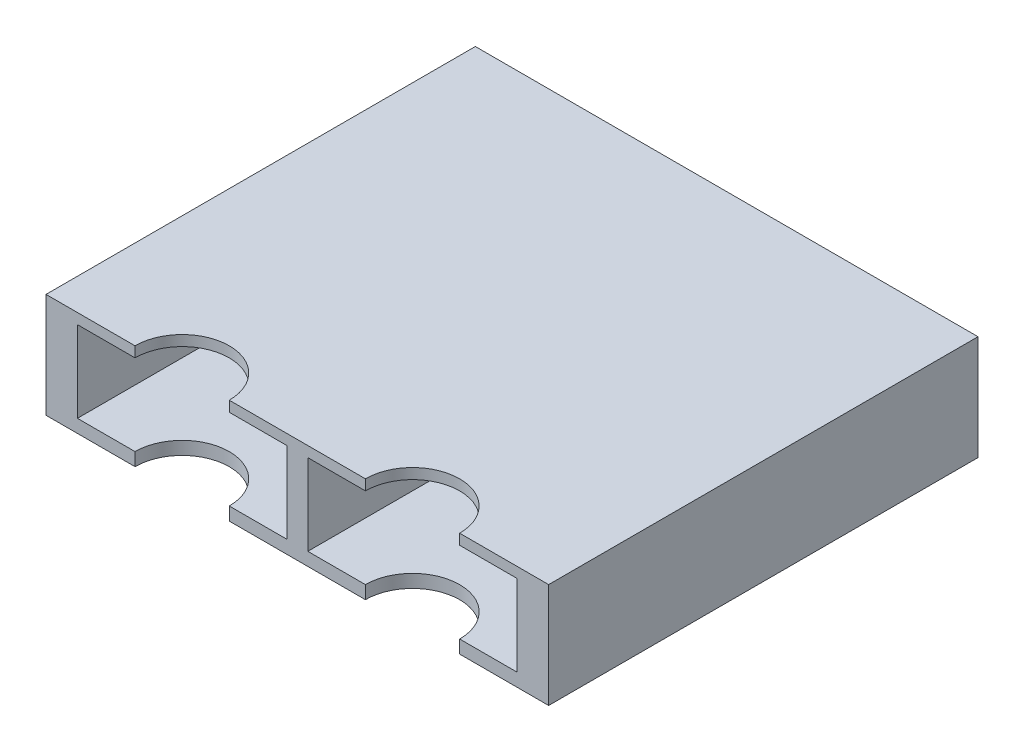
ISO-10303-21;
HEADER;
FILE_DESCRIPTION(('STEP AP214'),'2;1');
FILE_NAME('part.step','',(''),(''),'','','');
FILE_SCHEMA(('AUTOMOTIVE_DESIGN { 1 0 10303 214 1 1 1 1 }'));
ENDSEC;
DATA;
#1=APPLICATION_CONTEXT('core data for automotive mechanical design processes');
#2=APPLICATION_PROTOCOL_DEFINITION('international standard','automotive_design',2000,#1);
#3=PRODUCT_CONTEXT('',#1,'mechanical');
#4=PRODUCT('Part','Part','',(#3));
#5=PRODUCT_RELATED_PRODUCT_CATEGORY('part','',(#4));
#6=PRODUCT_DEFINITION_FORMATION('','',#4);
#7=PRODUCT_DEFINITION_CONTEXT('part definition',#1,'design');
#8=PRODUCT_DEFINITION('design','',#6,#7);
#9=PRODUCT_DEFINITION_SHAPE('','',#8);
#10=(LENGTH_UNIT() NAMED_UNIT(*) SI_UNIT(.MILLI.,.METRE.));
#11=(NAMED_UNIT(*) PLANE_ANGLE_UNIT() SI_UNIT($,.RADIAN.));
#12=(NAMED_UNIT(*) SI_UNIT($,.STERADIAN.) SOLID_ANGLE_UNIT());
#13=UNCERTAINTY_MEASURE_WITH_UNIT(LENGTH_MEASURE(1.E-05),#10,'distance_accuracy_value','');
#14=(GEOMETRIC_REPRESENTATION_CONTEXT(3) GLOBAL_UNCERTAINTY_ASSIGNED_CONTEXT((#13)) GLOBAL_UNIT_ASSIGNED_CONTEXT((#10,
#11,#12)) REPRESENTATION_CONTEXT('',''));
#15=CARTESIAN_POINT('',(0.,0.,0.));
#16=DIRECTION('',(0.,0.,1.));
#17=DIRECTION('',(1.,0.,0.));
#18=AXIS2_PLACEMENT_3D('',#15,#16,#17);
#19=CARTESIAN_POINT('',(26.,0.,82.));
#20=DIRECTION('',(0.,1.,0.));
#21=DIRECTION('',(0.,0.,1.));
#22=AXIS2_PLACEMENT_3D('',#19,#20,#21);
#23=CYLINDRICAL_SURFACE('',#22,9.);
#24=DIRECTION('',(0.,1.,0.));
#25=VECTOR('',#24,1.);
#26=CARTESIAN_POINT('',(35.,0.,82.));
#27=LINE('',#26,#25);
#28=CARTESIAN_POINT('',(35.,0.,82.));
#29=VERTEX_POINT('',#28);
#30=CARTESIAN_POINT('',(35.,2.5,82.));
#31=VERTEX_POINT('',#30);
#32=EDGE_CURVE('E259',#29,#31,#27,.T.);
#33=ORIENTED_EDGE('',*,*,#32,.T.);
#34=CARTESIAN_POINT('',(26.,2.5,82.));
#35=DIRECTION('',(0.,-1.,0.));
#36=DIRECTION('',(1.,0.,0.));
#37=AXIS2_PLACEMENT_3D('',#34,#35,#36);
#38=CIRCLE('',#37,9.);
#39=CARTESIAN_POINT('',(17.,2.5,82.));
#40=VERTEX_POINT('',#39);
#41=EDGE_CURVE('E11',#31,#40,#38,.F.);
#42=ORIENTED_EDGE('',*,*,#41,.T.);
#43=DIRECTION('',(0.,1.,0.));
#44=VECTOR('',#43,1.);
#45=CARTESIAN_POINT('',(17.,0.,82.));
#46=LINE('',#45,#44);
#47=CARTESIAN_POINT('',(17.,0.,82.));
#48=VERTEX_POINT('',#47);
#49=EDGE_CURVE('E277',#48,#40,#46,.T.);
#50=ORIENTED_EDGE('',*,*,#49,.F.);
#51=CARTESIAN_POINT('',(26.,0.,82.));
#52=DIRECTION('',(0.,1.,0.));
#53=DIRECTION('',(0.,0.,1.));
#54=AXIS2_PLACEMENT_3D('',#51,#52,#53);
#55=CIRCLE('',#54,9.);
#56=EDGE_CURVE('E268',#29,#48,#55,.T.);
#57=ORIENTED_EDGE('',*,*,#56,.F.);
#58=EDGE_LOOP('',(#33,#42,#50,#57));
#59=FACE_BOUND('',#58,.T.);
#60=ADVANCED_FACE('F37',(#59),#23,.F.);
#61=CARTESIAN_POINT('',(70.,0.,82.));
#62=DIRECTION('',(0.,1.,0.));
#63=DIRECTION('',(0.,0.,1.));
#64=AXIS2_PLACEMENT_3D('',#61,#62,#63);
#65=CYLINDRICAL_SURFACE('',#64,8.99999999999999);
#66=DIRECTION('',(0.,1.,0.));
#67=VECTOR('',#66,1.);
#68=CARTESIAN_POINT('',(61.,0.,82.));
#69=LINE('',#68,#67);
#70=CARTESIAN_POINT('',(61.,18.,82.));
#71=VERTEX_POINT('',#70);
#72=CARTESIAN_POINT('',(61.,20.,82.));
#73=VERTEX_POINT('',#72);
#74=EDGE_CURVE('E255',#71,#73,#69,.T.);
#75=ORIENTED_EDGE('',*,*,#74,.F.);
#76=CARTESIAN_POINT('',(70.,18.,82.));
#77=DIRECTION('',(0.,1.,0.));
#78=DIRECTION('',(-1.,0.,0.));
#79=AXIS2_PLACEMENT_3D('',#76,#77,#78);
#80=CIRCLE('',#79,8.99999999999999);
#81=CARTESIAN_POINT('',(79.,18.,82.));
#82=VERTEX_POINT('',#81);
#83=EDGE_CURVE('E317',#71,#82,#80,.F.);
#84=ORIENTED_EDGE('',*,*,#83,.T.);
#85=DIRECTION('',(0.,1.,0.));
#86=VECTOR('',#85,1.);
#87=CARTESIAN_POINT('',(79.,0.,82.));
#88=LINE('',#87,#86);
#89=CARTESIAN_POINT('',(79.,20.,82.));
#90=VERTEX_POINT('',#89);
#91=EDGE_CURVE('E264',#82,#90,#88,.T.);
#92=ORIENTED_EDGE('',*,*,#91,.T.);
#93=CARTESIAN_POINT('',(70.,20.,82.));
#94=DIRECTION('',(0.,1.,0.));
#95=DIRECTION('',(0.,0.,-1.));
#96=AXIS2_PLACEMENT_3D('',#93,#94,#95);
#97=CIRCLE('',#96,8.99999999999999);
#98=EDGE_CURVE('E256',#90,#73,#97,.T.);
#99=ORIENTED_EDGE('',*,*,#98,.T.);
#100=EDGE_LOOP('',(#75,#84,#92,#99));
#101=FACE_BOUND('',#100,.T.);
#102=ADVANCED_FACE('F370',(#101),#65,.F.);
#103=CARTESIAN_POINT('',(0.,0.,82.));
#104=DIRECTION('',(0.,0.,-1.));
#105=DIRECTION('',(-1.,0.,0.));
#106=AXIS2_PLACEMENT_3D('',#103,#104,#105);
#107=PLANE('',#106);
#108=DIRECTION('',(0.,1.,0.));
#109=VECTOR('',#108,1.);
#110=CARTESIAN_POINT('',(46.,18.,82.));
#111=LINE('',#110,#109);
#112=CARTESIAN_POINT('',(46.,2.50000000000001,82.));
#113=VERTEX_POINT('',#112);
#114=CARTESIAN_POINT('',(46.,18.,82.));
#115=VERTEX_POINT('',#114);
#116=EDGE_CURVE('E182',#113,#115,#111,.T.);
#117=ORIENTED_EDGE('',*,*,#116,.F.);
#118=DIRECTION('',(1.,0.,0.));
#119=VECTOR('',#118,1.);
#120=CARTESIAN_POINT('',(46.,2.50000000000001,82.));
#121=LINE('',#120,#119);
#122=EDGE_CURVE('E199',#31,#113,#121,.T.);
#123=ORIENTED_EDGE('',*,*,#122,.F.);
#124=ORIENTED_EDGE('',*,*,#32,.F.);
#125=DIRECTION('',(1.,0.,0.));
#126=VECTOR('',#125,1.);
#127=CARTESIAN_POINT('',(0.,0.,82.));
#128=LINE('',#127,#126);
#129=CARTESIAN_POINT('',(61.,0.,82.));
#130=VERTEX_POINT('',#129);
#131=EDGE_CURVE('E289',#29,#130,#128,.T.);
#132=ORIENTED_EDGE('',*,*,#131,.T.);
#133=CARTESIAN_POINT('',(61.,2.50000000000001,82.));
#134=VERTEX_POINT('',#133);
#135=EDGE_CURVE('E265',#130,#134,#69,.T.);
#136=ORIENTED_EDGE('',*,*,#135,.T.);
#137=DIRECTION('',(1.,0.,0.));
#138=VECTOR('',#137,1.);
#139=CARTESIAN_POINT('',(50.,2.50000000000001,82.));
#140=LINE('',#139,#138);
#141=CARTESIAN_POINT('',(50.,2.50000000000001,82.));
#142=VERTEX_POINT('',#141);
#143=EDGE_CURVE('E60',#142,#134,#140,.T.);
#144=ORIENTED_EDGE('',*,*,#143,.F.);
#145=DIRECTION('',(0.,-1.,0.));
#146=VECTOR('',#145,1.);
#147=CARTESIAN_POINT('',(50.,18.,82.));
#148=LINE('',#147,#146);
#149=CARTESIAN_POINT('',(50.,18.,82.));
#150=VERTEX_POINT('',#149);
#151=EDGE_CURVE('E236',#150,#142,#148,.T.);
#152=ORIENTED_EDGE('',*,*,#151,.F.);
#153=DIRECTION('',(-1.,0.,0.));
#154=VECTOR('',#153,1.);
#155=CARTESIAN_POINT('',(50.,18.,82.));
#156=LINE('',#155,#154);
#157=EDGE_CURVE('E237',#71,#150,#156,.T.);
#158=ORIENTED_EDGE('',*,*,#157,.F.);
#159=ORIENTED_EDGE('',*,*,#74,.T.);
#160=DIRECTION('',(-1.,0.,0.));
#161=VECTOR('',#160,1.);
#162=CARTESIAN_POINT('',(0.,20.,82.));
#163=LINE('',#162,#161);
#164=CARTESIAN_POINT('',(35.,20.,82.));
#165=VERTEX_POINT('',#164);
#166=EDGE_CURVE('E296',#73,#165,#163,.T.);
#167=ORIENTED_EDGE('',*,*,#166,.T.);
#168=CARTESIAN_POINT('',(35.,18.,82.));
#169=VERTEX_POINT('',#168);
#170=EDGE_CURVE('E276',#169,#165,#27,.T.);
#171=ORIENTED_EDGE('',*,*,#170,.F.);
#172=DIRECTION('',(-1.,0.,0.));
#173=VECTOR('',#172,1.);
#174=CARTESIAN_POINT('',(46.,18.,82.));
#175=LINE('',#174,#173);
#176=EDGE_CURVE('E52',#115,#169,#175,.T.);
#177=ORIENTED_EDGE('',*,*,#176,.F.);
#178=EDGE_LOOP('',(#117,#123,#124,#132,#136,#144,#152,#158,#159,#167,#171,#177));
#179=FACE_BOUND('',#178,.T.);
#180=ADVANCED_FACE('F327',(#179),#107,.F.);
#181=ORIENTED_EDGE('',*,*,#49,.T.);
#182=CARTESIAN_POINT('',(6.00000000000001,2.5,82.));
#183=VERTEX_POINT('',#182);
#184=EDGE_CURVE('E197',#183,#40,#121,.T.);
#185=ORIENTED_EDGE('',*,*,#184,.F.);
#186=DIRECTION('',(0.,-1.,0.));
#187=VECTOR('',#186,1.);
#188=CARTESIAN_POINT('',(6.00000000000001,18.,82.));
#189=LINE('',#188,#187);
#190=CARTESIAN_POINT('',(6.00000000000001,18.,82.));
#191=VERTEX_POINT('',#190);
#192=EDGE_CURVE('E211',#191,#183,#189,.T.);
#193=ORIENTED_EDGE('',*,*,#192,.F.);
#194=CARTESIAN_POINT('',(17.,18.,82.));
#195=VERTEX_POINT('',#194);
#196=EDGE_CURVE('E208',#195,#191,#175,.T.);
#197=ORIENTED_EDGE('',*,*,#196,.F.);
#198=CARTESIAN_POINT('',(17.,20.,82.));
#199=VERTEX_POINT('',#198);
#200=EDGE_CURVE('E271',#195,#199,#46,.T.);
#201=ORIENTED_EDGE('',*,*,#200,.T.);
#202=CARTESIAN_POINT('',(0.,20.,82.));
#203=VERTEX_POINT('',#202);
#204=EDGE_CURVE('E291',#199,#203,#163,.T.);
#205=ORIENTED_EDGE('',*,*,#204,.T.);
#206=DIRECTION('',(0.,-1.,0.));
#207=VECTOR('',#206,1.);
#208=CARTESIAN_POINT('',(0.,0.,82.));
#209=LINE('',#208,#207);
#210=CARTESIAN_POINT('',(0.,0.,82.));
#211=VERTEX_POINT('',#210);
#212=EDGE_CURVE('E280',#203,#211,#209,.T.);
#213=ORIENTED_EDGE('',*,*,#212,.T.);
#214=EDGE_CURVE('E285',#211,#48,#128,.T.);
#215=ORIENTED_EDGE('',*,*,#214,.T.);
#216=EDGE_LOOP('',(#181,#185,#193,#197,#201,#205,#213,#215));
#217=FACE_BOUND('',#216,.T.);
#218=ADVANCED_FACE('F336',(#217),#107,.F.);
#219=CARTESIAN_POINT('',(0.,0.,82.));
#220=DIRECTION('',(1.,0.,0.));
#221=DIRECTION('',(0.,0.,-1.));
#222=AXIS2_PLACEMENT_3D('',#219,#220,#221);
#223=PLANE('',#222);
#224=DIRECTION('',(0.,-1.,0.));
#225=VECTOR('',#224,1.);
#226=CARTESIAN_POINT('',(0.,0.,0.));
#227=LINE('',#226,#225);
#228=CARTESIAN_POINT('',(0.,20.,0.));
#229=VERTEX_POINT('',#228);
#230=CARTESIAN_POINT('',(0.,0.,0.));
#231=VERTEX_POINT('',#230);
#232=EDGE_CURVE('E263',#229,#231,#227,.T.);
#233=ORIENTED_EDGE('',*,*,#232,.T.);
#234=DIRECTION('',(0.,0.,-1.));
#235=VECTOR('',#234,1.);
#236=CARTESIAN_POINT('',(0.,0.,82.));
#237=LINE('',#236,#235);
#238=EDGE_CURVE('E312',#211,#231,#237,.T.);
#239=ORIENTED_EDGE('',*,*,#238,.F.);
#240=ORIENTED_EDGE('',*,*,#212,.F.);
#241=DIRECTION('',(0.,0.,-1.));
#242=VECTOR('',#241,1.);
#243=CARTESIAN_POINT('',(0.,20.,82.));
#244=LINE('',#243,#242);
#245=EDGE_CURVE('E295',#203,#229,#244,.T.);
#246=ORIENTED_EDGE('',*,*,#245,.T.);
#247=EDGE_LOOP('',(#233,#239,#240,#246));
#248=FACE_BOUND('',#247,.T.);
#249=ADVANCED_FACE('F39',(#248),#223,.F.);
#250=CARTESIAN_POINT('',(0.,0.,82.));
#251=DIRECTION('',(0.,1.,0.));
#252=DIRECTION('',(0.,0.,1.));
#253=AXIS2_PLACEMENT_3D('',#250,#251,#252);
#254=PLANE('',#253);
#255=CARTESIAN_POINT('',(93.,0.,64.));
#256=DIRECTION('',(0.,-1.,0.));
#257=DIRECTION('',(0.,0.,-1.));
#258=AXIS2_PLACEMENT_3D('',#255,#256,#257);
#259=CIRCLE('',#258,1.5);
#260=CARTESIAN_POINT('',(93.,0.,62.5));
#261=VERTEX_POINT('',#260);
#262=EDGE_CURVE('E381',#261,#261,#259,.T.);
#263=ORIENTED_EDGE('',*,*,#262,.F.);
#264=EDGE_LOOP('',(#263));
#265=FACE_BOUND('',#264,.T.);
#266=CARTESIAN_POINT('',(10.,0.,2.5));
#267=DIRECTION('',(0.,-1.,0.));
#268=DIRECTION('',(0.,0.,1.));
#269=AXIS2_PLACEMENT_3D('',#266,#267,#268);
#270=CIRCLE('',#269,1.5);
#271=CARTESIAN_POINT('',(10.,0.,4.));
#272=VERTEX_POINT('',#271);
#273=EDGE_CURVE('E387',#272,#272,#270,.T.);
#274=ORIENTED_EDGE('',*,*,#273,.F.);
#275=EDGE_LOOP('',(#274));
#276=FACE_BOUND('',#275,.T.);
#277=CARTESIAN_POINT('',(3.00000000000003,0.,64.));
#278=DIRECTION('',(0.,-1.,0.));
#279=DIRECTION('',(0.,0.,1.));
#280=AXIS2_PLACEMENT_3D('',#277,#278,#279);
#281=CIRCLE('',#280,1.5);
#282=CARTESIAN_POINT('',(3.00000000000003,0.,65.5));
#283=VERTEX_POINT('',#282);
#284=EDGE_CURVE('E393',#283,#283,#281,.T.);
#285=ORIENTED_EDGE('',*,*,#284,.F.);
#286=EDGE_LOOP('',(#285));
#287=FACE_BOUND('',#286,.T.);
#288=CARTESIAN_POINT('',(86.,0.,2.5));
#289=DIRECTION('',(0.,-1.,0.));
#290=DIRECTION('',(0.,0.,-1.));
#291=AXIS2_PLACEMENT_3D('',#288,#289,#290);
#292=CIRCLE('',#291,1.5);
#293=CARTESIAN_POINT('',(86.,0.,1.00000000000001));
#294=VERTEX_POINT('',#293);
#295=EDGE_CURVE('E202',#294,#294,#292,.T.);
#296=ORIENTED_EDGE('',*,*,#295,.F.);
#297=EDGE_LOOP('',(#296));
#298=FACE_BOUND('',#297,.T.);
#299=CARTESIAN_POINT('',(79.,0.,82.));
#300=VERTEX_POINT('',#299);
#301=CARTESIAN_POINT('',(96.,0.,82.));
#302=VERTEX_POINT('',#301);
#303=EDGE_CURVE('E283',#300,#302,#128,.T.);
#304=ORIENTED_EDGE('',*,*,#303,.F.);
#305=CARTESIAN_POINT('',(70.,0.,82.));
#306=DIRECTION('',(0.,1.,0.));
#307=DIRECTION('',(0.,0.,-1.));
#308=AXIS2_PLACEMENT_3D('',#305,#306,#307);
#309=CIRCLE('',#308,8.99999999999999);
#310=EDGE_CURVE('E252',#300,#130,#309,.T.);
#311=ORIENTED_EDGE('',*,*,#310,.T.);
#312=ORIENTED_EDGE('',*,*,#131,.F.);
#313=ORIENTED_EDGE('',*,*,#56,.T.);
#314=ORIENTED_EDGE('',*,*,#214,.F.);
#315=ORIENTED_EDGE('',*,*,#238,.T.);
#316=DIRECTION('',(1.,0.,0.));
#317=VECTOR('',#316,1.);
#318=CARTESIAN_POINT('',(0.,0.,0.));
#319=LINE('',#318,#317);
#320=CARTESIAN_POINT('',(96.,0.,0.));
#321=VERTEX_POINT('',#320);
#322=EDGE_CURVE('E299',#231,#321,#319,.T.);
#323=ORIENTED_EDGE('',*,*,#322,.T.);
#324=DIRECTION('',(0.,0.,-1.));
#325=VECTOR('',#324,1.);
#326=CARTESIAN_POINT('',(96.,0.,82.));
#327=LINE('',#326,#325);
#328=EDGE_CURVE('E309',#302,#321,#327,.T.);
#329=ORIENTED_EDGE('',*,*,#328,.F.);
#330=EDGE_LOOP('',(#304,#311,#312,#313,#314,#315,#323,#329));
#331=FACE_BOUND('',#330,.T.);
#332=ADVANCED_FACE('F345',(#265,#276,#287,#298,#331),#254,.F.);
#333=CARTESIAN_POINT('',(96.,0.,82.));
#334=DIRECTION('',(-1.,0.,0.));
#335=DIRECTION('',(0.,0.,1.));
#336=AXIS2_PLACEMENT_3D('',#333,#334,#335);
#337=PLANE('',#336);
#338=DIRECTION('',(0.,1.,0.));
#339=VECTOR('',#338,1.);
#340=CARTESIAN_POINT('',(96.,0.,0.));
#341=LINE('',#340,#339);
#342=CARTESIAN_POINT('',(96.,20.,0.));
#343=VERTEX_POINT('',#342);
#344=EDGE_CURVE('E301',#321,#343,#341,.T.);
#345=ORIENTED_EDGE('',*,*,#344,.T.);
#346=DIRECTION('',(0.,0.,-1.));
#347=VECTOR('',#346,1.);
#348=CARTESIAN_POINT('',(96.,20.,82.));
#349=LINE('',#348,#347);
#350=CARTESIAN_POINT('',(96.,20.,82.));
#351=VERTEX_POINT('',#350);
#352=EDGE_CURVE('E306',#351,#343,#349,.T.);
#353=ORIENTED_EDGE('',*,*,#352,.F.);
#354=DIRECTION('',(0.,1.,0.));
#355=VECTOR('',#354,1.);
#356=CARTESIAN_POINT('',(96.,0.,82.));
#357=LINE('',#356,#355);
#358=EDGE_CURVE('E288',#302,#351,#357,.T.);
#359=ORIENTED_EDGE('',*,*,#358,.F.);
#360=ORIENTED_EDGE('',*,*,#328,.T.);
#361=EDGE_LOOP('',(#345,#353,#359,#360));
#362=FACE_BOUND('',#361,.T.);
#363=ADVANCED_FACE('F365',(#362),#337,.F.);
#364=CARTESIAN_POINT('',(0.,20.,82.));
#365=DIRECTION('',(0.,-1.,0.));
#366=DIRECTION('',(0.,0.,-1.));
#367=AXIS2_PLACEMENT_3D('',#364,#365,#366);
#368=PLANE('',#367);
#369=ORIENTED_EDGE('',*,*,#166,.F.);
#370=ORIENTED_EDGE('',*,*,#98,.F.);
#371=EDGE_CURVE('E292',#351,#90,#163,.T.);
#372=ORIENTED_EDGE('',*,*,#371,.F.);
#373=ORIENTED_EDGE('',*,*,#352,.T.);
#374=DIRECTION('',(-1.,0.,0.));
#375=VECTOR('',#374,1.);
#376=CARTESIAN_POINT('',(0.,20.,0.));
#377=LINE('',#376,#375);
#378=EDGE_CURVE('E284',#343,#229,#377,.T.);
#379=ORIENTED_EDGE('',*,*,#378,.T.);
#380=ORIENTED_EDGE('',*,*,#245,.F.);
#381=ORIENTED_EDGE('',*,*,#204,.F.);
#382=CARTESIAN_POINT('',(26.,20.,82.));
#383=DIRECTION('',(0.,1.,0.));
#384=DIRECTION('',(0.,0.,1.));
#385=AXIS2_PLACEMENT_3D('',#382,#383,#384);
#386=CIRCLE('',#385,9.);
#387=EDGE_CURVE('E216',#165,#199,#386,.T.);
#388=ORIENTED_EDGE('',*,*,#387,.F.);
#389=EDGE_LOOP('',(#369,#370,#372,#373,#379,#380,#381,#388));
#390=FACE_BOUND('',#389,.T.);
#391=ADVANCED_FACE('F339',(#390),#368,.F.);
#392=ORIENTED_EDGE('',*,*,#91,.F.);
#393=CARTESIAN_POINT('',(90.,18.,82.));
#394=VERTEX_POINT('',#393);
#395=EDGE_CURVE('E234',#394,#82,#156,.T.);
#396=ORIENTED_EDGE('',*,*,#395,.F.);
#397=DIRECTION('',(0.,1.,0.));
#398=VECTOR('',#397,1.);
#399=CARTESIAN_POINT('',(90.,18.,82.));
#400=LINE('',#399,#398);
#401=CARTESIAN_POINT('',(90.,2.50000000000001,82.));
#402=VERTEX_POINT('',#401);
#403=EDGE_CURVE('E224',#402,#394,#400,.T.);
#404=ORIENTED_EDGE('',*,*,#403,.F.);
#405=CARTESIAN_POINT('',(79.,2.50000000000001,82.));
#406=VERTEX_POINT('',#405);
#407=EDGE_CURVE('E240',#406,#402,#140,.T.);
#408=ORIENTED_EDGE('',*,*,#407,.F.);
#409=EDGE_CURVE('E260',#300,#406,#88,.T.);
#410=ORIENTED_EDGE('',*,*,#409,.F.);
#411=ORIENTED_EDGE('',*,*,#303,.T.);
#412=ORIENTED_EDGE('',*,*,#358,.T.);
#413=ORIENTED_EDGE('',*,*,#371,.T.);
#414=EDGE_LOOP('',(#392,#396,#404,#408,#410,#411,#412,#413));
#415=FACE_BOUND('',#414,.T.);
#416=ADVANCED_FACE('F359',(#415),#107,.F.);
#417=CARTESIAN_POINT('',(0.,0.,0.));
#418=DIRECTION('',(0.,0.,-1.));
#419=DIRECTION('',(-1.,0.,0.));
#420=AXIS2_PLACEMENT_3D('',#417,#418,#419);
#421=PLANE('',#420);
#422=ORIENTED_EDGE('',*,*,#232,.F.);
#423=ORIENTED_EDGE('',*,*,#378,.F.);
#424=ORIENTED_EDGE('',*,*,#344,.F.);
#425=ORIENTED_EDGE('',*,*,#322,.F.);
#426=EDGE_LOOP('',(#422,#423,#424,#425));
#427=FACE_BOUND('',#426,.T.);
#428=ADVANCED_FACE('F433',(#427),#421,.T.);
#429=ORIENTED_EDGE('',*,*,#200,.F.);
#430=CARTESIAN_POINT('',(26.,18.,82.));
#431=DIRECTION('',(0.,1.,0.));
#432=DIRECTION('',(0.,0.,1.));
#433=AXIS2_PLACEMENT_3D('',#430,#431,#432);
#434=CIRCLE('',#433,9.);
#435=EDGE_CURVE('E45',#195,#169,#434,.F.);
#436=ORIENTED_EDGE('',*,*,#435,.T.);
#437=ORIENTED_EDGE('',*,*,#170,.T.);
#438=ORIENTED_EDGE('',*,*,#387,.T.);
#439=EDGE_LOOP('',(#429,#436,#437,#438));
#440=FACE_BOUND('',#439,.T.);
#441=ADVANCED_FACE('F322',(#440),#23,.F.);
#442=ORIENTED_EDGE('',*,*,#409,.T.);
#443=CARTESIAN_POINT('',(70.,2.50000000000001,82.));
#444=DIRECTION('',(0.,-1.,0.));
#445=DIRECTION('',(1.,0.,0.));
#446=AXIS2_PLACEMENT_3D('',#443,#444,#445);
#447=CIRCLE('',#446,8.99999999999999);
#448=EDGE_CURVE('E315',#406,#134,#447,.F.);
#449=ORIENTED_EDGE('',*,*,#448,.T.);
#450=ORIENTED_EDGE('',*,*,#135,.F.);
#451=ORIENTED_EDGE('',*,*,#310,.F.);
#452=EDGE_LOOP('',(#442,#449,#450,#451));
#453=FACE_BOUND('',#452,.T.);
#454=ADVANCED_FACE('F430',(#453),#65,.F.);
#455=CARTESIAN_POINT('',(50.,18.,6.00000000000001));
#456=DIRECTION('',(0.,1.,0.));
#457=DIRECTION('',(-1.,0.,0.));
#458=AXIS2_PLACEMENT_3D('',#455,#456,#457);
#459=PLANE('',#458);
#460=ORIENTED_EDGE('',*,*,#157,.T.);
#461=DIRECTION('',(0.,0.,1.));
#462=VECTOR('',#461,1.);
#463=CARTESIAN_POINT('',(50.,18.,6.00000000000001));
#464=LINE('',#463,#462);
#465=CARTESIAN_POINT('',(50.,18.,6.00000000000001));
#466=VERTEX_POINT('',#465);
#467=EDGE_CURVE('E233',#466,#150,#464,.T.);
#468=ORIENTED_EDGE('',*,*,#467,.F.);
#469=DIRECTION('',(-1.,0.,0.));
#470=VECTOR('',#469,1.);
#471=CARTESIAN_POINT('',(50.,18.,6.00000000000001));
#472=LINE('',#471,#470);
#473=CARTESIAN_POINT('',(90.,18.,6.00000000000001));
#474=VERTEX_POINT('',#473);
#475=EDGE_CURVE('E220',#474,#466,#472,.T.);
#476=ORIENTED_EDGE('',*,*,#475,.F.);
#477=DIRECTION('',(0.,0.,1.));
#478=VECTOR('',#477,1.);
#479=CARTESIAN_POINT('',(90.,18.,6.00000000000001));
#480=LINE('',#479,#478);
#481=EDGE_CURVE('E209',#474,#394,#480,.T.);
#482=ORIENTED_EDGE('',*,*,#481,.T.);
#483=ORIENTED_EDGE('',*,*,#395,.T.);
#484=ORIENTED_EDGE('',*,*,#83,.F.);
#485=EDGE_LOOP('',(#460,#468,#476,#482,#483,#484));
#486=FACE_BOUND('',#485,.T.);
#487=ADVANCED_FACE('F372',(#486),#459,.F.);
#488=CARTESIAN_POINT('',(50.,2.50000000000001,6.00000000000001));
#489=DIRECTION('',(0.,-1.,0.));
#490=DIRECTION('',(1.,0.,0.));
#491=AXIS2_PLACEMENT_3D('',#488,#489,#490);
#492=PLANE('',#491);
#493=ORIENTED_EDGE('',*,*,#407,.T.);
#494=DIRECTION('',(0.,0.,1.));
#495=VECTOR('',#494,1.);
#496=CARTESIAN_POINT('',(90.,2.50000000000001,6.00000000000001));
#497=LINE('',#496,#495);
#498=CARTESIAN_POINT('',(90.,2.50000000000001,6.00000000000001));
#499=VERTEX_POINT('',#498);
#500=EDGE_CURVE('E245',#499,#402,#497,.T.);
#501=ORIENTED_EDGE('',*,*,#500,.F.);
#502=DIRECTION('',(1.,0.,0.));
#503=VECTOR('',#502,1.);
#504=CARTESIAN_POINT('',(50.,2.50000000000001,6.00000000000001));
#505=LINE('',#504,#503);
#506=CARTESIAN_POINT('',(50.,2.50000000000001,6.00000000000001));
#507=VERTEX_POINT('',#506);
#508=EDGE_CURVE('E227',#507,#499,#505,.T.);
#509=ORIENTED_EDGE('',*,*,#508,.F.);
#510=DIRECTION('',(0.,0.,1.));
#511=VECTOR('',#510,1.);
#512=CARTESIAN_POINT('',(50.,2.50000000000001,6.00000000000001));
#513=LINE('',#512,#511);
#514=EDGE_CURVE('E248',#507,#142,#513,.T.);
#515=ORIENTED_EDGE('',*,*,#514,.T.);
#516=ORIENTED_EDGE('',*,*,#143,.T.);
#517=ORIENTED_EDGE('',*,*,#448,.F.);
#518=EDGE_LOOP('',(#493,#501,#509,#515,#516,#517));
#519=FACE_BOUND('',#518,.T.);
#520=ADVANCED_FACE('F489',(#519),#492,.F.);
#521=CARTESIAN_POINT('',(90.,18.,6.00000000000001));
#522=DIRECTION('',(1.,0.,0.));
#523=DIRECTION('',(0.,0.,-1.));
#524=AXIS2_PLACEMENT_3D('',#521,#522,#523);
#525=PLANE('',#524);
#526=ORIENTED_EDGE('',*,*,#403,.T.);
#527=ORIENTED_EDGE('',*,*,#481,.F.);
#528=DIRECTION('',(0.,1.,0.));
#529=VECTOR('',#528,1.);
#530=CARTESIAN_POINT('',(90.,18.,6.00000000000001));
#531=LINE('',#530,#529);
#532=EDGE_CURVE('E230',#499,#474,#531,.T.);
#533=ORIENTED_EDGE('',*,*,#532,.F.);
#534=ORIENTED_EDGE('',*,*,#500,.T.);
#535=EDGE_LOOP('',(#526,#527,#533,#534));
#536=FACE_BOUND('',#535,.T.);
#537=ADVANCED_FACE('F499',(#536),#525,.F.);
#538=CARTESIAN_POINT('',(50.,18.,6.00000000000001));
#539=DIRECTION('',(-1.,0.,0.));
#540=DIRECTION('',(0.,-1.,0.));
#541=AXIS2_PLACEMENT_3D('',#538,#539,#540);
#542=PLANE('',#541);
#543=ORIENTED_EDGE('',*,*,#151,.T.);
#544=ORIENTED_EDGE('',*,*,#514,.F.);
#545=DIRECTION('',(0.,-1.,0.));
#546=VECTOR('',#545,1.);
#547=CARTESIAN_POINT('',(50.,18.,6.00000000000001));
#548=LINE('',#547,#546);
#549=EDGE_CURVE('E223',#466,#507,#548,.T.);
#550=ORIENTED_EDGE('',*,*,#549,.F.);
#551=ORIENTED_EDGE('',*,*,#467,.T.);
#552=EDGE_LOOP('',(#543,#544,#550,#551));
#553=FACE_BOUND('',#552,.T.);
#554=ADVANCED_FACE('F508',(#553),#542,.F.);
#555=CARTESIAN_POINT('',(0.,0.,6.00000000000001));
#556=DIRECTION('',(0.,0.,-1.));
#557=DIRECTION('',(-1.,0.,0.));
#558=AXIS2_PLACEMENT_3D('',#555,#556,#557);
#559=PLANE('',#558);
#560=ORIENTED_EDGE('',*,*,#475,.T.);
#561=ORIENTED_EDGE('',*,*,#549,.T.);
#562=ORIENTED_EDGE('',*,*,#508,.T.);
#563=ORIENTED_EDGE('',*,*,#532,.T.);
#564=EDGE_LOOP('',(#560,#561,#562,#563));
#565=FACE_BOUND('',#564,.T.);
#566=ADVANCED_FACE('F518',(#565),#559,.F.);
#567=CARTESIAN_POINT('',(46.,2.50000000000001,6.00000000000001));
#568=DIRECTION('',(0.,-1.,0.));
#569=DIRECTION('',(1.,0.,0.));
#570=AXIS2_PLACEMENT_3D('',#567,#568,#569);
#571=PLANE('',#570);
#572=ORIENTED_EDGE('',*,*,#122,.T.);
#573=DIRECTION('',(0.,0.,1.));
#574=VECTOR('',#573,1.);
#575=CARTESIAN_POINT('',(46.,2.50000000000001,6.00000000000001));
#576=LINE('',#575,#574);
#577=CARTESIAN_POINT('',(46.,2.50000000000001,6.00000000000001));
#578=VERTEX_POINT('',#577);
#579=EDGE_CURVE('E214',#578,#113,#576,.T.);
#580=ORIENTED_EDGE('',*,*,#579,.F.);
#581=DIRECTION('',(1.,0.,0.));
#582=VECTOR('',#581,1.);
#583=CARTESIAN_POINT('',(46.,2.50000000000001,6.00000000000001));
#584=LINE('',#583,#582);
#585=CARTESIAN_POINT('',(6.00000000000001,2.5,6.00000000000001));
#586=VERTEX_POINT('',#585);
#587=EDGE_CURVE('E184',#586,#578,#584,.T.);
#588=ORIENTED_EDGE('',*,*,#587,.F.);
#589=DIRECTION('',(0.,0.,1.));
#590=VECTOR('',#589,1.);
#591=CARTESIAN_POINT('',(6.00000000000001,2.5,6.00000000000001));
#592=LINE('',#591,#590);
#593=EDGE_CURVE('E217',#586,#183,#592,.T.);
#594=ORIENTED_EDGE('',*,*,#593,.T.);
#595=ORIENTED_EDGE('',*,*,#184,.T.);
#596=ORIENTED_EDGE('',*,*,#41,.F.);
#597=EDGE_LOOP('',(#572,#580,#588,#594,#595,#596));
#598=FACE_BOUND('',#597,.T.);
#599=ADVANCED_FACE('F354',(#598),#571,.F.);
#600=CARTESIAN_POINT('',(46.,18.,6.00000000000001));
#601=DIRECTION('',(0.,1.,0.));
#602=DIRECTION('',(0.,0.,1.));
#603=AXIS2_PLACEMENT_3D('',#600,#601,#602);
#604=PLANE('',#603);
#605=ORIENTED_EDGE('',*,*,#196,.T.);
#606=DIRECTION('',(0.,0.,1.));
#607=VECTOR('',#606,1.);
#608=CARTESIAN_POINT('',(6.00000000000001,18.,6.00000000000001));
#609=LINE('',#608,#607);
#610=CARTESIAN_POINT('',(6.00000000000001,18.,6.00000000000001));
#611=VERTEX_POINT('',#610);
#612=EDGE_CURVE('E183',#611,#191,#609,.T.);
#613=ORIENTED_EDGE('',*,*,#612,.F.);
#614=DIRECTION('',(-1.,0.,0.));
#615=VECTOR('',#614,1.);
#616=CARTESIAN_POINT('',(46.,18.,6.00000000000001));
#617=LINE('',#616,#615);
#618=CARTESIAN_POINT('',(46.,18.,6.00000000000001));
#619=VERTEX_POINT('',#618);
#620=EDGE_CURVE('E187',#619,#611,#617,.T.);
#621=ORIENTED_EDGE('',*,*,#620,.F.);
#622=DIRECTION('',(0.,0.,1.));
#623=VECTOR('',#622,1.);
#624=CARTESIAN_POINT('',(46.,18.,6.00000000000001));
#625=LINE('',#624,#623);
#626=EDGE_CURVE('E174',#619,#115,#625,.T.);
#627=ORIENTED_EDGE('',*,*,#626,.T.);
#628=ORIENTED_EDGE('',*,*,#176,.T.);
#629=ORIENTED_EDGE('',*,*,#435,.F.);
#630=EDGE_LOOP('',(#605,#613,#621,#627,#628,#629));
#631=FACE_BOUND('',#630,.T.);
#632=ADVANCED_FACE('F188',(#631),#604,.F.);
#633=CARTESIAN_POINT('',(46.,18.,6.00000000000001));
#634=DIRECTION('',(1.,0.,0.));
#635=DIRECTION('',(0.,0.,-1.));
#636=AXIS2_PLACEMENT_3D('',#633,#634,#635);
#637=PLANE('',#636);
#638=ORIENTED_EDGE('',*,*,#116,.T.);
#639=ORIENTED_EDGE('',*,*,#626,.F.);
#640=DIRECTION('',(0.,1.,0.));
#641=VECTOR('',#640,1.);
#642=CARTESIAN_POINT('',(46.,18.,6.00000000000001));
#643=LINE('',#642,#641);
#644=EDGE_CURVE('E179',#578,#619,#643,.T.);
#645=ORIENTED_EDGE('',*,*,#644,.F.);
#646=ORIENTED_EDGE('',*,*,#579,.T.);
#647=EDGE_LOOP('',(#638,#639,#645,#646));
#648=FACE_BOUND('',#647,.T.);
#649=ADVANCED_FACE('F176',(#648),#637,.F.);
#650=CARTESIAN_POINT('',(6.00000000000001,18.,6.00000000000001));
#651=DIRECTION('',(-1.,0.,0.));
#652=DIRECTION('',(0.,0.,1.));
#653=AXIS2_PLACEMENT_3D('',#650,#651,#652);
#654=PLANE('',#653);
#655=ORIENTED_EDGE('',*,*,#192,.T.);
#656=ORIENTED_EDGE('',*,*,#593,.F.);
#657=DIRECTION('',(0.,-1.,0.));
#658=VECTOR('',#657,1.);
#659=CARTESIAN_POINT('',(6.00000000000001,18.,6.00000000000001));
#660=LINE('',#659,#658);
#661=EDGE_CURVE('E193',#611,#586,#660,.T.);
#662=ORIENTED_EDGE('',*,*,#661,.F.);
#663=ORIENTED_EDGE('',*,*,#612,.T.);
#664=EDGE_LOOP('',(#655,#656,#662,#663));
#665=FACE_BOUND('',#664,.T.);
#666=ADVANCED_FACE('F422',(#665),#654,.F.);
#667=CARTESIAN_POINT('',(0.,0.,6.00000000000001));
#668=DIRECTION('',(0.,0.,-1.));
#669=DIRECTION('',(-1.,0.,0.));
#670=AXIS2_PLACEMENT_3D('',#667,#668,#669);
#671=PLANE('',#670);
#672=ORIENTED_EDGE('',*,*,#644,.T.);
#673=ORIENTED_EDGE('',*,*,#620,.T.);
#674=ORIENTED_EDGE('',*,*,#661,.T.);
#675=ORIENTED_EDGE('',*,*,#587,.T.);
#676=EDGE_LOOP('',(#672,#673,#674,#675));
#677=FACE_BOUND('',#676,.T.);
#678=ADVANCED_FACE('F195',(#677),#671,.F.);
#679=CARTESIAN_POINT('',(86.,10.,2.5));
#680=DIRECTION('',(0.,-1.,0.));
#681=DIRECTION('',(0.,0.,-1.));
#682=AXIS2_PLACEMENT_3D('',#679,#680,#681);
#683=CYLINDRICAL_SURFACE('',#682,1.5);
#684=CARTESIAN_POINT('',(86.,10.,2.5));
#685=DIRECTION('',(0.,-1.,0.));
#686=DIRECTION('',(0.,0.,-1.));
#687=AXIS2_PLACEMENT_3D('',#684,#685,#686);
#688=CIRCLE('',#687,1.5);
#689=CARTESIAN_POINT('',(86.,10.,1.00000000000001));
#690=VERTEX_POINT('',#689);
#691=EDGE_CURVE('E374',#690,#690,#688,.T.);
#692=ORIENTED_EDGE('',*,*,#691,.F.);
#693=EDGE_LOOP('',(#692));
#694=FACE_BOUND('',#693,.T.);
#695=ORIENTED_EDGE('',*,*,#295,.T.);
#696=EDGE_LOOP('',(#695));
#697=FACE_BOUND('',#696,.T.);
#698=ADVANCED_FACE('F413',(#694,#697),#683,.F.);
#699=CARTESIAN_POINT('',(86.,10.,2.5));
#700=DIRECTION('',(0.,-1.,0.));
#701=DIRECTION('',(0.,0.,-1.));
#702=AXIS2_PLACEMENT_3D('',#699,#700,#701);
#703=PLANE('',#702);
#704=ORIENTED_EDGE('',*,*,#691,.T.);
#705=EDGE_LOOP('',(#704));
#706=FACE_BOUND('',#705,.T.);
#707=ADVANCED_FACE('F404',(#706),#703,.T.);
#708=CARTESIAN_POINT('',(3.00000000000003,10.,64.));
#709=DIRECTION('',(0.,-1.,0.));
#710=DIRECTION('',(0.,0.,-1.));
#711=AXIS2_PLACEMENT_3D('',#708,#709,#710);
#712=CYLINDRICAL_SURFACE('',#711,1.5);
#713=CARTESIAN_POINT('',(3.00000000000003,10.,64.));
#714=DIRECTION('',(0.,-1.,0.));
#715=DIRECTION('',(0.,0.,1.));
#716=AXIS2_PLACEMENT_3D('',#713,#714,#715);
#717=CIRCLE('',#716,1.5);
#718=CARTESIAN_POINT('',(3.00000000000003,10.,65.5));
#719=VERTEX_POINT('',#718);
#720=EDGE_CURVE('E379',#719,#719,#717,.T.);
#721=ORIENTED_EDGE('',*,*,#720,.F.);
#722=EDGE_LOOP('',(#721));
#723=FACE_BOUND('',#722,.T.);
#724=ORIENTED_EDGE('',*,*,#284,.T.);
#725=EDGE_LOOP('',(#724));
#726=FACE_BOUND('',#725,.T.);
#727=ADVANCED_FACE('F401',(#723,#726),#712,.F.);
#728=CARTESIAN_POINT('',(3.00000000000003,10.,64.));
#729=DIRECTION('',(0.,1.,0.));
#730=DIRECTION('',(0.,0.,1.));
#731=AXIS2_PLACEMENT_3D('',#728,#729,#730);
#732=PLANE('',#731);
#733=ORIENTED_EDGE('',*,*,#720,.T.);
#734=EDGE_LOOP('',(#733));
#735=FACE_BOUND('',#734,.T.);
#736=ADVANCED_FACE('F399',(#735),#732,.F.);
#737=CARTESIAN_POINT('',(10.,10.,2.5));
#738=DIRECTION('',(0.,-1.,0.));
#739=DIRECTION('',(0.,0.,-1.));
#740=AXIS2_PLACEMENT_3D('',#737,#738,#739);
#741=CYLINDRICAL_SURFACE('',#740,1.5);
#742=CARTESIAN_POINT('',(10.,10.,2.5));
#743=DIRECTION('',(0.,-1.,0.));
#744=DIRECTION('',(0.,0.,1.));
#745=AXIS2_PLACEMENT_3D('',#742,#743,#744);
#746=CIRCLE('',#745,1.5);
#747=CARTESIAN_POINT('',(10.,10.,4.));
#748=VERTEX_POINT('',#747);
#749=EDGE_CURVE('E390',#748,#748,#746,.T.);
#750=ORIENTED_EDGE('',*,*,#749,.F.);
#751=EDGE_LOOP('',(#750));
#752=FACE_BOUND('',#751,.T.);
#753=ORIENTED_EDGE('',*,*,#273,.T.);
#754=EDGE_LOOP('',(#753));
#755=FACE_BOUND('',#754,.T.);
#756=ADVANCED_FACE('F597',(#752,#755),#741,.F.);
#757=CARTESIAN_POINT('',(10.,10.,2.5));
#758=DIRECTION('',(0.,1.,0.));
#759=DIRECTION('',(0.,0.,1.));
#760=AXIS2_PLACEMENT_3D('',#757,#758,#759);
#761=PLANE('',#760);
#762=ORIENTED_EDGE('',*,*,#749,.T.);
#763=EDGE_LOOP('',(#762));
#764=FACE_BOUND('',#763,.T.);
#765=ADVANCED_FACE('F606',(#764),#761,.F.);
#766=CARTESIAN_POINT('',(93.,10.,64.));
#767=DIRECTION('',(0.,-1.,0.));
#768=DIRECTION('',(0.,0.,-1.));
#769=AXIS2_PLACEMENT_3D('',#766,#767,#768);
#770=CYLINDRICAL_SURFACE('',#769,1.5);
#771=CARTESIAN_POINT('',(93.,10.,64.));
#772=DIRECTION('',(0.,-1.,0.));
#773=DIRECTION('',(0.,0.,-1.));
#774=AXIS2_PLACEMENT_3D('',#771,#772,#773);
#775=CIRCLE('',#774,1.5);
#776=CARTESIAN_POINT('',(93.,10.,62.5));
#777=VERTEX_POINT('',#776);
#778=EDGE_CURVE('E384',#777,#777,#775,.T.);
#779=ORIENTED_EDGE('',*,*,#778,.F.);
#780=EDGE_LOOP('',(#779));
#781=FACE_BOUND('',#780,.T.);
#782=ORIENTED_EDGE('',*,*,#262,.T.);
#783=EDGE_LOOP('',(#782));
#784=FACE_BOUND('',#783,.T.);
#785=ADVANCED_FACE('F616',(#781,#784),#770,.F.);
#786=CARTESIAN_POINT('',(93.,10.,64.));
#787=DIRECTION('',(0.,-1.,0.));
#788=DIRECTION('',(0.,0.,-1.));
#789=AXIS2_PLACEMENT_3D('',#786,#787,#788);
#790=PLANE('',#789);
#791=ORIENTED_EDGE('',*,*,#778,.T.);
#792=EDGE_LOOP('',(#791));
#793=FACE_BOUND('',#792,.T.);
#794=ADVANCED_FACE('F626',(#793),#790,.T.);
#795=CLOSED_SHELL('',(#60,#102,#180,#218,#249,#332,#363,#391,#416,#428,#441,#454,#487,#520,#537,
#554,#566,#599,#632,#649,#666,#678,#698,#707,#727,#736,#756,#765,#785,#794));
#796=MANIFOLD_SOLID_BREP('B2',#795);
#797=ADVANCED_BREP_SHAPE_REPRESENTATION('',(#18,#796),#14);
#798=SHAPE_DEFINITION_REPRESENTATION(#9,#797);
ENDSEC;
END-ISO-10303-21;
